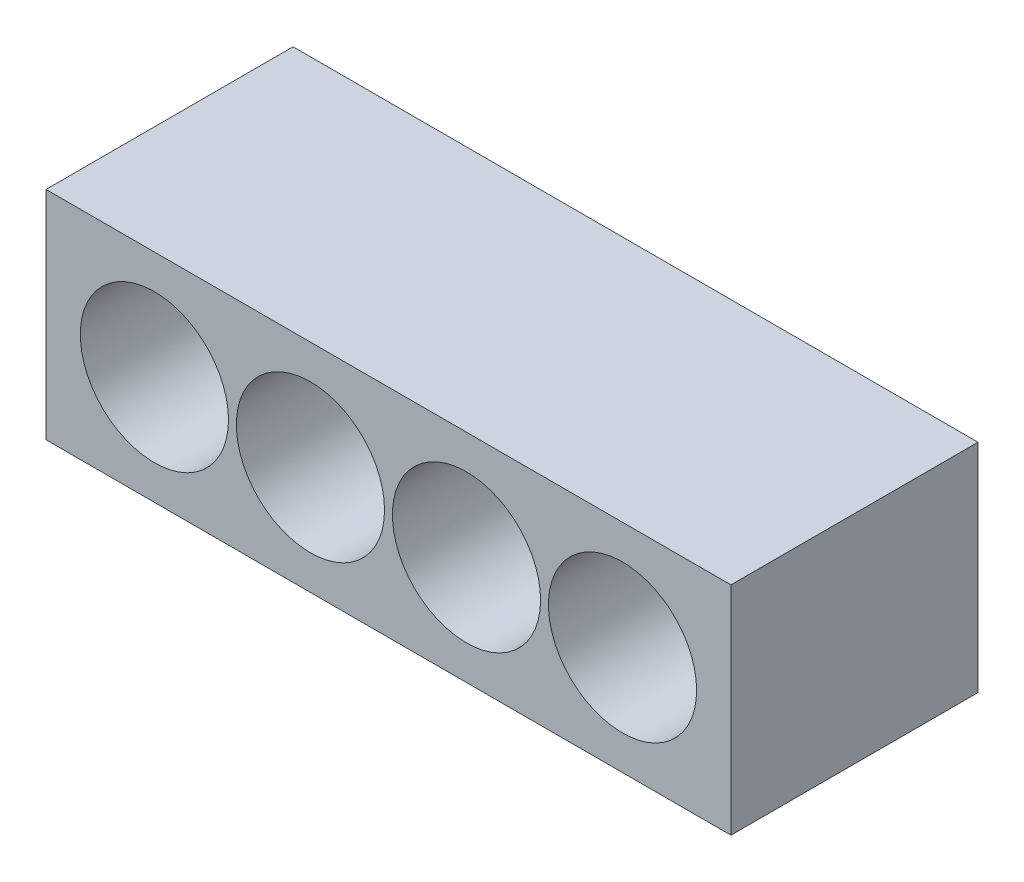
ISO-10303-21;
HEADER;
FILE_DESCRIPTION(('STEP AP214'),'2;1');
FILE_NAME('part.step','',(''),(''),'','','');
FILE_SCHEMA(('AUTOMOTIVE_DESIGN { 1 0 10303 214 1 1 1 1 }'));
ENDSEC;
DATA;
#1=APPLICATION_CONTEXT('core data for automotive mechanical design processes');
#2=APPLICATION_PROTOCOL_DEFINITION('international standard','automotive_design',2000,#1);
#3=PRODUCT_CONTEXT('',#1,'mechanical');
#4=PRODUCT('Part','Part','',(#3));
#5=PRODUCT_RELATED_PRODUCT_CATEGORY('part','',(#4));
#6=PRODUCT_DEFINITION_FORMATION('','',#4);
#7=PRODUCT_DEFINITION_CONTEXT('part definition',#1,'design');
#8=PRODUCT_DEFINITION('design','',#6,#7);
#9=PRODUCT_DEFINITION_SHAPE('','',#8);
#10=(LENGTH_UNIT() NAMED_UNIT(*) SI_UNIT(.MILLI.,.METRE.));
#11=(NAMED_UNIT(*) PLANE_ANGLE_UNIT() SI_UNIT($,.RADIAN.));
#12=(NAMED_UNIT(*) SI_UNIT($,.STERADIAN.) SOLID_ANGLE_UNIT());
#13=UNCERTAINTY_MEASURE_WITH_UNIT(LENGTH_MEASURE(1.E-05),#10,'distance_accuracy_value','');
#14=(GEOMETRIC_REPRESENTATION_CONTEXT(3) GLOBAL_UNCERTAINTY_ASSIGNED_CONTEXT((#13)) GLOBAL_UNIT_ASSIGNED_CONTEXT((#10,
#11,#12)) REPRESENTATION_CONTEXT('',''));
#15=CARTESIAN_POINT('',(0.,0.,0.));
#16=DIRECTION('',(0.,0.,1.));
#17=DIRECTION('',(1.,0.,0.));
#18=AXIS2_PLACEMENT_3D('',#15,#16,#17);
#19=CARTESIAN_POINT('',(-114.846127091432,-63.1826836146954,144.));
#20=DIRECTION('',(0.,0.,1.));
#21=DIRECTION('',(1.,0.,0.));
#22=AXIS2_PLACEMENT_3D('',#19,#20,#21);
#23=PLANE('',#22);
#24=CARTESIAN_POINT('',(130.241640727883,0.,144.));
#25=DIRECTION('',(0.,0.,1.));
#26=DIRECTION('',(1.,0.,0.));
#27=AXIS2_PLACEMENT_3D('',#24,#25,#26);
#28=CIRCLE('',#27,43.1826836146954);
#29=CARTESIAN_POINT('',(173.424324342579,0.,144.));
#30=VERTEX_POINT('',#29);
#31=EDGE_CURVE('E126',#30,#30,#28,.T.);
#32=ORIENTED_EDGE('',*,*,#31,.F.);
#33=EDGE_LOOP('',(#32));
#34=FACE_BOUND('',#33,.T.);
#35=CARTESIAN_POINT('',(-51.6634434767369,0.,144.));
#36=DIRECTION('',(0.,0.,1.));
#37=DIRECTION('',(1.,0.,0.));
#38=AXIS2_PLACEMENT_3D('',#35,#36,#37);
#39=CIRCLE('',#38,43.1826836146954);
#40=CARTESIAN_POINT('',(-8.48075986204158,0.,144.));
#41=VERTEX_POINT('',#40);
#42=EDGE_CURVE('E88',#41,#41,#39,.T.);
#43=ORIENTED_EDGE('',*,*,#42,.F.);
#44=EDGE_LOOP('',(#43));
#45=FACE_BOUND('',#44,.T.);
#46=DIRECTION('',(0.,-1.,0.));
#47=VECTOR('',#46,1.);
#48=CARTESIAN_POINT('',(-114.846127091432,63.1826836146954,144.));
#49=LINE('',#48,#47);
#50=CARTESIAN_POINT('',(-114.846127091432,63.1826836146954,144.));
#51=VERTEX_POINT('',#50);
#52=CARTESIAN_POINT('',(-114.846127091432,-63.1826836146954,144.));
#53=VERTEX_POINT('',#52);
#54=EDGE_CURVE('E98',#51,#53,#49,.T.);
#55=ORIENTED_EDGE('',*,*,#54,.T.);
#56=DIRECTION('',(1.,0.,0.));
#57=VECTOR('',#56,1.);
#58=CARTESIAN_POINT('',(-114.846127091432,-63.1826836146954,144.));
#59=LINE('',#58,#57);
#60=CARTESIAN_POINT('',(284.376866444889,-63.1826836146954,144.));
#61=VERTEX_POINT('',#60);
#62=EDGE_CURVE('E83',#53,#61,#59,.T.);
#63=ORIENTED_EDGE('',*,*,#62,.T.);
#64=DIRECTION('',(0.,1.,0.));
#65=VECTOR('',#64,1.);
#66=CARTESIAN_POINT('',(284.376866444889,63.1826836146954,144.));
#67=LINE('',#66,#65);
#68=CARTESIAN_POINT('',(284.376866444889,63.1826836146954,144.));
#69=VERTEX_POINT('',#68);
#70=EDGE_CURVE('E49',#61,#69,#67,.T.);
#71=ORIENTED_EDGE('',*,*,#70,.T.);
#72=DIRECTION('',(-1.,0.,0.));
#73=VECTOR('',#72,1.);
#74=CARTESIAN_POINT('',(-114.846127091432,63.1826836146954,144.));
#75=LINE('',#74,#73);
#76=EDGE_CURVE('E44',#69,#51,#75,.T.);
#77=ORIENTED_EDGE('',*,*,#76,.T.);
#78=EDGE_LOOP('',(#55,#63,#71,#77));
#79=FACE_BOUND('',#78,.T.);
#80=CARTESIAN_POINT('',(39.2890986255731,0.,144.));
#81=DIRECTION('',(0.,0.,1.));
#82=DIRECTION('',(1.,0.,0.));
#83=AXIS2_PLACEMENT_3D('',#80,#81,#82);
#84=CIRCLE('',#83,43.1826836146954);
#85=CARTESIAN_POINT('',(82.4717822402685,0.,144.));
#86=VERTEX_POINT('',#85);
#87=EDGE_CURVE('E117',#86,#86,#84,.T.);
#88=ORIENTED_EDGE('',*,*,#87,.F.);
#89=EDGE_LOOP('',(#88));
#90=FACE_BOUND('',#89,.T.);
#91=CARTESIAN_POINT('',(221.194182830193,0.,144.));
#92=DIRECTION('',(0.,0.,1.));
#93=DIRECTION('',(1.,0.,0.));
#94=AXIS2_PLACEMENT_3D('',#91,#92,#93);
#95=CIRCLE('',#94,43.1826836146953);
#96=CARTESIAN_POINT('',(264.376866444889,0.,144.));
#97=VERTEX_POINT('',#96);
#98=EDGE_CURVE('E120',#97,#97,#95,.T.);
#99=ORIENTED_EDGE('',*,*,#98,.F.);
#100=EDGE_LOOP('',(#99));
#101=FACE_BOUND('',#100,.T.);
#102=ADVANCED_FACE('F29',(#34,#45,#79,#90,#101),#23,.T.);
#103=CARTESIAN_POINT('',(-114.846127091432,-63.1826836146954,0.));
#104=DIRECTION('',(0.,0.,1.));
#105=DIRECTION('',(1.,0.,0.));
#106=AXIS2_PLACEMENT_3D('',#103,#104,#105);
#107=PLANE('',#106);
#108=CARTESIAN_POINT('',(130.241640727883,0.,0.));
#109=DIRECTION('',(0.,0.,1.));
#110=DIRECTION('',(1.,0.,0.));
#111=AXIS2_PLACEMENT_3D('',#108,#109,#110);
#112=CIRCLE('',#111,43.1826836146954);
#113=CARTESIAN_POINT('',(173.424324342579,0.,0.));
#114=VERTEX_POINT('',#113);
#115=EDGE_CURVE('E122',#114,#114,#112,.T.);
#116=ORIENTED_EDGE('',*,*,#115,.T.);
#117=EDGE_LOOP('',(#116));
#118=FACE_BOUND('',#117,.T.);
#119=CARTESIAN_POINT('',(-51.6634434767369,0.,0.));
#120=DIRECTION('',(0.,0.,1.));
#121=DIRECTION('',(1.,0.,0.));
#122=AXIS2_PLACEMENT_3D('',#119,#120,#121);
#123=CIRCLE('',#122,43.1826836146954);
#124=CARTESIAN_POINT('',(-8.48075986204158,0.,0.));
#125=VERTEX_POINT('',#124);
#126=EDGE_CURVE('E91',#125,#125,#123,.T.);
#127=ORIENTED_EDGE('',*,*,#126,.T.);
#128=EDGE_LOOP('',(#127));
#129=FACE_BOUND('',#128,.T.);
#130=DIRECTION('',(0.,-1.,0.));
#131=VECTOR('',#130,1.);
#132=CARTESIAN_POINT('',(-114.846127091432,63.1826836146954,0.));
#133=LINE('',#132,#131);
#134=CARTESIAN_POINT('',(-114.846127091432,63.1826836146954,0.));
#135=VERTEX_POINT('',#134);
#136=CARTESIAN_POINT('',(-114.846127091432,-63.1826836146954,0.));
#137=VERTEX_POINT('',#136);
#138=EDGE_CURVE('E75',#135,#137,#133,.T.);
#139=ORIENTED_EDGE('',*,*,#138,.F.);
#140=DIRECTION('',(-1.,0.,0.));
#141=VECTOR('',#140,1.);
#142=CARTESIAN_POINT('',(-114.846127091432,63.1826836146954,0.));
#143=LINE('',#142,#141);
#144=CARTESIAN_POINT('',(284.376866444889,63.1826836146954,0.));
#145=VERTEX_POINT('',#144);
#146=EDGE_CURVE('E96',#145,#135,#143,.T.);
#147=ORIENTED_EDGE('',*,*,#146,.F.);
#148=DIRECTION('',(0.,1.,0.));
#149=VECTOR('',#148,1.);
#150=CARTESIAN_POINT('',(284.376866444889,63.1826836146954,0.));
#151=LINE('',#150,#149);
#152=CARTESIAN_POINT('',(284.376866444889,-63.1826836146954,0.));
#153=VERTEX_POINT('',#152);
#154=EDGE_CURVE('E76',#153,#145,#151,.T.);
#155=ORIENTED_EDGE('',*,*,#154,.F.);
#156=DIRECTION('',(1.,0.,0.));
#157=VECTOR('',#156,1.);
#158=CARTESIAN_POINT('',(-114.846127091432,-63.1826836146954,0.));
#159=LINE('',#158,#157);
#160=EDGE_CURVE('E70',#137,#153,#159,.T.);
#161=ORIENTED_EDGE('',*,*,#160,.F.);
#162=EDGE_LOOP('',(#139,#147,#155,#161));
#163=FACE_BOUND('',#162,.T.);
#164=CARTESIAN_POINT('',(39.2890986255731,0.,0.));
#165=DIRECTION('',(0.,0.,1.));
#166=DIRECTION('',(1.,0.,0.));
#167=AXIS2_PLACEMENT_3D('',#164,#165,#166);
#168=CIRCLE('',#167,43.1826836146954);
#169=CARTESIAN_POINT('',(82.4717822402685,0.,0.));
#170=VERTEX_POINT('',#169);
#171=EDGE_CURVE('E133',#170,#170,#168,.T.);
#172=ORIENTED_EDGE('',*,*,#171,.T.);
#173=EDGE_LOOP('',(#172));
#174=FACE_BOUND('',#173,.T.);
#175=CARTESIAN_POINT('',(221.194182830193,0.,0.));
#176=DIRECTION('',(0.,0.,1.));
#177=DIRECTION('',(1.,0.,0.));
#178=AXIS2_PLACEMENT_3D('',#175,#176,#177);
#179=CIRCLE('',#178,43.1826836146953);
#180=CARTESIAN_POINT('',(264.376866444889,0.,0.));
#181=VERTEX_POINT('',#180);
#182=EDGE_CURVE('E123',#181,#181,#179,.T.);
#183=ORIENTED_EDGE('',*,*,#182,.T.);
#184=EDGE_LOOP('',(#183));
#185=FACE_BOUND('',#184,.T.);
#186=ADVANCED_FACE('F71',(#118,#129,#163,#174,#185),#107,.F.);
#187=CARTESIAN_POINT('',(-114.846127091432,63.1826836146954,144.));
#188=DIRECTION('',(1.,0.,0.));
#189=DIRECTION('',(0.,0.,-1.));
#190=AXIS2_PLACEMENT_3D('',#187,#188,#189);
#191=PLANE('',#190);
#192=ORIENTED_EDGE('',*,*,#138,.T.);
#193=DIRECTION('',(0.,0.,-1.));
#194=VECTOR('',#193,1.);
#195=CARTESIAN_POINT('',(-114.846127091432,-63.1826836146954,144.));
#196=LINE('',#195,#194);
#197=EDGE_CURVE('E11',#53,#137,#196,.T.);
#198=ORIENTED_EDGE('',*,*,#197,.F.);
#199=ORIENTED_EDGE('',*,*,#54,.F.);
#200=DIRECTION('',(0.,0.,-1.));
#201=VECTOR('',#200,1.);
#202=CARTESIAN_POINT('',(-114.846127091432,63.1826836146954,144.));
#203=LINE('',#202,#201);
#204=EDGE_CURVE('E87',#51,#135,#203,.T.);
#205=ORIENTED_EDGE('',*,*,#204,.T.);
#206=EDGE_LOOP('',(#192,#198,#199,#205));
#207=FACE_BOUND('',#206,.T.);
#208=ADVANCED_FACE('F31',(#207),#191,.F.);
#209=CARTESIAN_POINT('',(-114.846127091432,-63.1826836146954,144.));
#210=DIRECTION('',(0.,1.,0.));
#211=DIRECTION('',(0.,0.,1.));
#212=AXIS2_PLACEMENT_3D('',#209,#210,#211);
#213=PLANE('',#212);
#214=ORIENTED_EDGE('',*,*,#160,.T.);
#215=DIRECTION('',(0.,0.,-1.));
#216=VECTOR('',#215,1.);
#217=CARTESIAN_POINT('',(284.376866444889,-63.1826836146954,144.));
#218=LINE('',#217,#216);
#219=EDGE_CURVE('E37',#61,#153,#218,.T.);
#220=ORIENTED_EDGE('',*,*,#219,.F.);
#221=ORIENTED_EDGE('',*,*,#62,.F.);
#222=ORIENTED_EDGE('',*,*,#197,.T.);
#223=EDGE_LOOP('',(#214,#220,#221,#222));
#224=FACE_BOUND('',#223,.T.);
#225=ADVANCED_FACE('F82',(#224),#213,.F.);
#226=CARTESIAN_POINT('',(284.376866444889,63.1826836146954,144.));
#227=DIRECTION('',(-1.,0.,0.));
#228=DIRECTION('',(0.,0.,1.));
#229=AXIS2_PLACEMENT_3D('',#226,#227,#228);
#230=PLANE('',#229);
#231=ORIENTED_EDGE('',*,*,#154,.T.);
#232=DIRECTION('',(0.,0.,-1.));
#233=VECTOR('',#232,1.);
#234=CARTESIAN_POINT('',(284.376866444889,63.1826836146954,144.));
#235=LINE('',#234,#233);
#236=EDGE_CURVE('E104',#69,#145,#235,.T.);
#237=ORIENTED_EDGE('',*,*,#236,.F.);
#238=ORIENTED_EDGE('',*,*,#70,.F.);
#239=ORIENTED_EDGE('',*,*,#219,.T.);
#240=EDGE_LOOP('',(#231,#237,#238,#239));
#241=FACE_BOUND('',#240,.T.);
#242=ADVANCED_FACE('F107',(#241),#230,.F.);
#243=CARTESIAN_POINT('',(-114.846127091432,63.1826836146954,144.));
#244=DIRECTION('',(0.,-1.,0.));
#245=DIRECTION('',(0.,0.,-1.));
#246=AXIS2_PLACEMENT_3D('',#243,#244,#245);
#247=PLANE('',#246);
#248=ORIENTED_EDGE('',*,*,#146,.T.);
#249=ORIENTED_EDGE('',*,*,#204,.F.);
#250=ORIENTED_EDGE('',*,*,#76,.F.);
#251=ORIENTED_EDGE('',*,*,#236,.T.);
#252=EDGE_LOOP('',(#248,#249,#250,#251));
#253=FACE_BOUND('',#252,.T.);
#254=ADVANCED_FACE('F109',(#253),#247,.F.);
#255=CARTESIAN_POINT('',(-51.6634434767369,0.,144.));
#256=DIRECTION('',(0.,0.,-1.));
#257=DIRECTION('',(-1.,0.,0.));
#258=AXIS2_PLACEMENT_3D('',#255,#256,#257);
#259=CYLINDRICAL_SURFACE('',#258,43.1826836146954);
#260=ORIENTED_EDGE('',*,*,#42,.T.);
#261=EDGE_LOOP('',(#260));
#262=FACE_BOUND('',#261,.T.);
#263=ORIENTED_EDGE('',*,*,#126,.F.);
#264=EDGE_LOOP('',(#263));
#265=FACE_BOUND('',#264,.T.);
#266=ADVANCED_FACE('F140',(#262,#265),#259,.F.);
#267=CARTESIAN_POINT('',(39.2890986255731,0.,144.));
#268=DIRECTION('',(0.,0.,-1.));
#269=DIRECTION('',(-1.,0.,0.));
#270=AXIS2_PLACEMENT_3D('',#267,#268,#269);
#271=CYLINDRICAL_SURFACE('',#270,43.1826836146954);
#272=ORIENTED_EDGE('',*,*,#87,.T.);
#273=EDGE_LOOP('',(#272));
#274=FACE_BOUND('',#273,.T.);
#275=ORIENTED_EDGE('',*,*,#171,.F.);
#276=EDGE_LOOP('',(#275));
#277=FACE_BOUND('',#276,.T.);
#278=ADVANCED_FACE('F142',(#274,#277),#271,.F.);
#279=CARTESIAN_POINT('',(130.241640727883,0.,144.));
#280=DIRECTION('',(0.,0.,-1.));
#281=DIRECTION('',(-1.,0.,0.));
#282=AXIS2_PLACEMENT_3D('',#279,#280,#281);
#283=CYLINDRICAL_SURFACE('',#282,43.1826836146954);
#284=ORIENTED_EDGE('',*,*,#31,.T.);
#285=EDGE_LOOP('',(#284));
#286=FACE_BOUND('',#285,.T.);
#287=ORIENTED_EDGE('',*,*,#115,.F.);
#288=EDGE_LOOP('',(#287));
#289=FACE_BOUND('',#288,.T.);
#290=ADVANCED_FACE('F149',(#286,#289),#283,.F.);
#291=CARTESIAN_POINT('',(221.194182830193,0.,144.));
#292=DIRECTION('',(0.,0.,-1.));
#293=DIRECTION('',(-1.,0.,0.));
#294=AXIS2_PLACEMENT_3D('',#291,#292,#293);
#295=CYLINDRICAL_SURFACE('',#294,43.1826836146953);
#296=ORIENTED_EDGE('',*,*,#98,.T.);
#297=EDGE_LOOP('',(#296));
#298=FACE_BOUND('',#297,.T.);
#299=ORIENTED_EDGE('',*,*,#182,.F.);
#300=EDGE_LOOP('',(#299));
#301=FACE_BOUND('',#300,.T.);
#302=ADVANCED_FACE('F196',(#298,#301),#295,.F.);
#303=CLOSED_SHELL('',(#102,#186,#208,#225,#242,#254,#266,#278,#290,#302));
#304=MANIFOLD_SOLID_BREP('B2',#303);
#305=ADVANCED_BREP_SHAPE_REPRESENTATION('',(#18,#304),#14);
#306=SHAPE_DEFINITION_REPRESENTATION(#9,#305);
ENDSEC;
END-ISO-10303-21;
